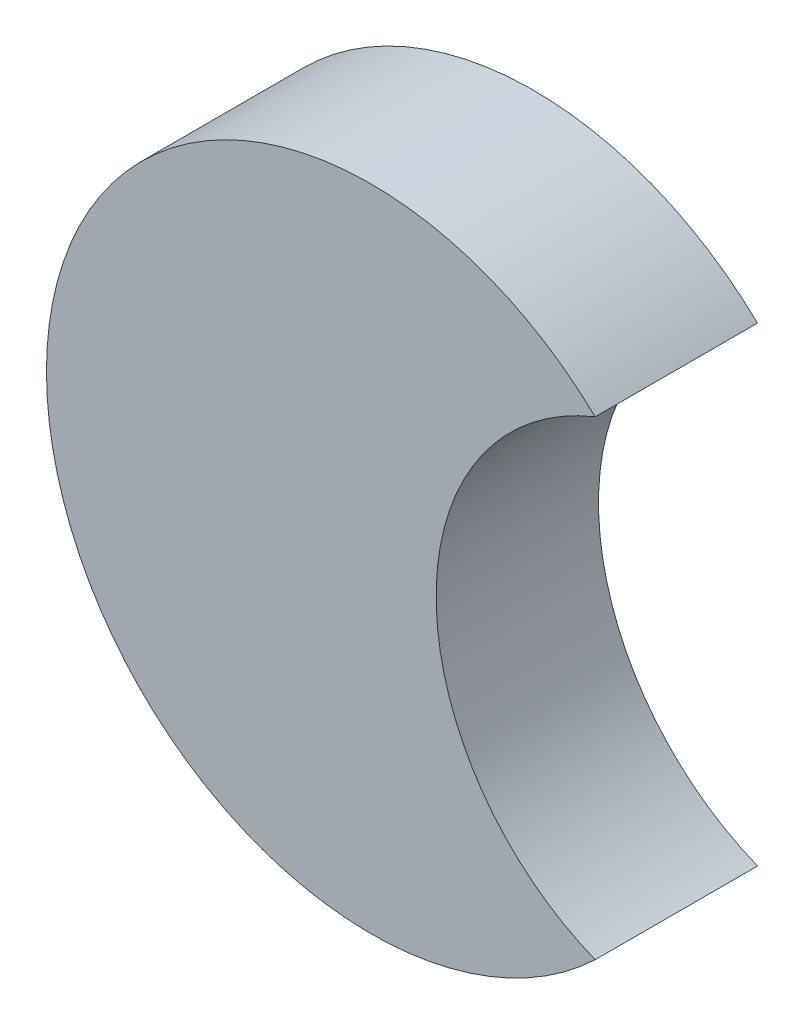
ISO-10303-21;
HEADER;
FILE_DESCRIPTION(('STEP AP214'),'2;1');
FILE_NAME('part.step','',(''),(''),'','','');
FILE_SCHEMA(('AUTOMOTIVE_DESIGN { 1 0 10303 214 1 1 1 1 }'));
ENDSEC;
DATA;
#1=APPLICATION_CONTEXT('core data for automotive mechanical design processes');
#2=APPLICATION_PROTOCOL_DEFINITION('international standard','automotive_design',2000,#1);
#3=PRODUCT_CONTEXT('',#1,'mechanical');
#4=PRODUCT('Part','Part','',(#3));
#5=PRODUCT_RELATED_PRODUCT_CATEGORY('part','',(#4));
#6=PRODUCT_DEFINITION_FORMATION('','',#4);
#7=PRODUCT_DEFINITION_CONTEXT('part definition',#1,'design');
#8=PRODUCT_DEFINITION('design','',#6,#7);
#9=PRODUCT_DEFINITION_SHAPE('','',#8);
#10=(LENGTH_UNIT() NAMED_UNIT(*) SI_UNIT(.MILLI.,.METRE.));
#11=(NAMED_UNIT(*) PLANE_ANGLE_UNIT() SI_UNIT($,.RADIAN.));
#12=(NAMED_UNIT(*) SI_UNIT($,.STERADIAN.) SOLID_ANGLE_UNIT());
#13=UNCERTAINTY_MEASURE_WITH_UNIT(LENGTH_MEASURE(1.E-05),#10,'distance_accuracy_value','');
#14=(GEOMETRIC_REPRESENTATION_CONTEXT(3) GLOBAL_UNCERTAINTY_ASSIGNED_CONTEXT((#13)) GLOBAL_UNIT_ASSIGNED_CONTEXT((#10,
#11,#12)) REPRESENTATION_CONTEXT('',''));
#15=CARTESIAN_POINT('',(0.,0.,0.));
#16=DIRECTION('',(0.,0.,1.));
#17=DIRECTION('',(1.,0.,0.));
#18=AXIS2_PLACEMENT_3D('',#15,#16,#17);
#19=CARTESIAN_POINT('',(0.,0.,25.));
#20=DIRECTION('',(0.,0.,-1.));
#21=DIRECTION('',(-1.,0.,0.));
#22=AXIS2_PLACEMENT_3D('',#19,#20,#21);
#23=CYLINDRICAL_SURFACE('',#22,50.);
#24=CARTESIAN_POINT('',(0.,0.,0.));
#25=DIRECTION('',(0.,0.,1.));
#26=DIRECTION('',(1.,0.,0.));
#27=AXIS2_PLACEMENT_3D('',#24,#25,#26);
#28=CIRCLE('',#27,50.);
#29=CARTESIAN_POINT('',(34.4897959183674,36.2001930590069,0.));
#30=VERTEX_POINT('',#29);
#31=CARTESIAN_POINT('',(34.4897959183674,-36.2001930590069,0.));
#32=VERTEX_POINT('',#31);
#33=EDGE_CURVE('E45',#30,#32,#28,.T.);
#34=ORIENTED_EDGE('',*,*,#33,.T.);
#35=DIRECTION('',(0.,0.,1.));
#36=VECTOR('',#35,1.);
#37=CARTESIAN_POINT('',(34.4897959183674,-36.2001930590069,12.5));
#38=LINE('',#37,#36);
#39=CARTESIAN_POINT('',(34.4897959183674,-36.2001930590069,25.));
#40=VERTEX_POINT('',#39);
#41=EDGE_CURVE('E61',#32,#40,#38,.T.);
#42=ORIENTED_EDGE('',*,*,#41,.T.);
#43=CARTESIAN_POINT('',(0.,0.,25.));
#44=DIRECTION('',(0.,0.,1.));
#45=DIRECTION('',(1.,0.,0.));
#46=AXIS2_PLACEMENT_3D('',#43,#44,#45);
#47=CIRCLE('',#46,50.);
#48=CARTESIAN_POINT('',(34.4897959183674,36.2001930590069,25.));
#49=VERTEX_POINT('',#48);
#50=EDGE_CURVE('E11',#49,#40,#47,.T.);
#51=ORIENTED_EDGE('',*,*,#50,.F.);
#52=DIRECTION('',(0.,0.,1.));
#53=VECTOR('',#52,1.);
#54=CARTESIAN_POINT('',(34.4897959183674,36.2001930590069,12.5));
#55=LINE('',#54,#53);
#56=EDGE_CURVE('E66',#49,#30,#55,.F.);
#57=ORIENTED_EDGE('',*,*,#56,.T.);
#58=EDGE_LOOP('',(#34,#42,#51,#57));
#59=FACE_BOUND('',#58,.T.);
#60=ADVANCED_FACE('F39',(#59),#23,.T.);
#61=CARTESIAN_POINT('',(0.,0.,25.));
#62=DIRECTION('',(0.,0.,1.));
#63=DIRECTION('',(1.,0.,0.));
#64=AXIS2_PLACEMENT_3D('',#61,#62,#63);
#65=PLANE('',#64);
#66=CARTESIAN_POINT('',(49.,0.,25.));
#67=DIRECTION('',(0.,0.,1.));
#68=DIRECTION('',(1.,0.,0.));
#69=AXIS2_PLACEMENT_3D('',#66,#67,#68);
#70=CIRCLE('',#69,39.);
#71=EDGE_CURVE('E59',#49,#40,#70,.T.);
#72=ORIENTED_EDGE('',*,*,#71,.F.);
#73=ORIENTED_EDGE('',*,*,#50,.T.);
#74=EDGE_LOOP('',(#72,#73));
#75=FACE_BOUND('',#74,.T.);
#76=ADVANCED_FACE('F77',(#75),#65,.T.);
#77=CARTESIAN_POINT('',(0.,0.,0.));
#78=DIRECTION('',(0.,0.,1.));
#79=DIRECTION('',(1.,0.,0.));
#80=AXIS2_PLACEMENT_3D('',#77,#78,#79);
#81=PLANE('',#80);
#82=ORIENTED_EDGE('',*,*,#33,.F.);
#83=CARTESIAN_POINT('',(49.,0.,0.));
#84=DIRECTION('',(0.,0.,1.));
#85=DIRECTION('',(1.,0.,0.));
#86=AXIS2_PLACEMENT_3D('',#83,#84,#85);
#87=CIRCLE('',#86,39.);
#88=EDGE_CURVE('E52',#30,#32,#87,.T.);
#89=ORIENTED_EDGE('',*,*,#88,.T.);
#90=EDGE_LOOP('',(#82,#89));
#91=FACE_BOUND('',#90,.T.);
#92=ADVANCED_FACE('F75',(#91),#81,.F.);
#93=CARTESIAN_POINT('',(49.,0.,0.));
#94=DIRECTION('',(0.,0.,1.));
#95=DIRECTION('',(1.,0.,0.));
#96=AXIS2_PLACEMENT_3D('',#93,#94,#95);
#97=CYLINDRICAL_SURFACE('',#96,39.);
#98=ORIENTED_EDGE('',*,*,#88,.F.);
#99=ORIENTED_EDGE('',*,*,#56,.F.);
#100=ORIENTED_EDGE('',*,*,#71,.T.);
#101=ORIENTED_EDGE('',*,*,#41,.F.);
#102=EDGE_LOOP('',(#98,#99,#100,#101));
#103=FACE_BOUND('',#102,.T.);
#104=ADVANCED_FACE('F62',(#103),#97,.F.);
#105=CLOSED_SHELL('',(#60,#76,#92,#104));
#106=MANIFOLD_SOLID_BREP('B2',#105);
#107=ADVANCED_BREP_SHAPE_REPRESENTATION('',(#18,#106),#14);
#108=SHAPE_DEFINITION_REPRESENTATION(#9,#107);
ENDSEC;
END-ISO-10303-21;
